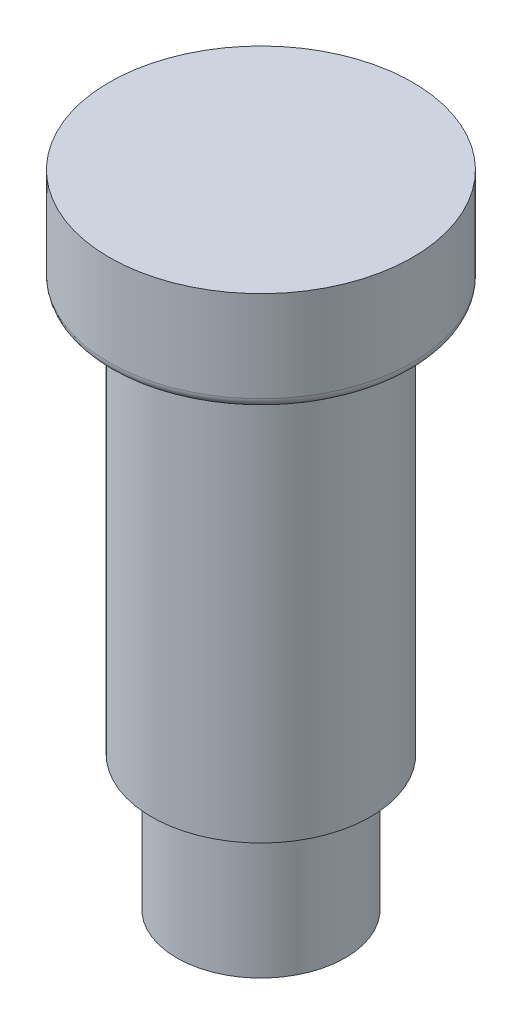
ISO-10303-21;
HEADER;
FILE_DESCRIPTION(('STEP AP214'),'2;1');
FILE_NAME('part.step','',(''),(''),'','','');
FILE_SCHEMA(('AUTOMOTIVE_DESIGN { 1 0 10303 214 1 1 1 1 }'));
ENDSEC;
DATA;
#1=APPLICATION_CONTEXT('core data for automotive mechanical design processes');
#2=APPLICATION_PROTOCOL_DEFINITION('international standard','automotive_design',2000,#1);
#3=PRODUCT_CONTEXT('',#1,'mechanical');
#4=PRODUCT('Part','Part','',(#3));
#5=PRODUCT_RELATED_PRODUCT_CATEGORY('part','',(#4));
#6=PRODUCT_DEFINITION_FORMATION('','',#4);
#7=PRODUCT_DEFINITION_CONTEXT('part definition',#1,'design');
#8=PRODUCT_DEFINITION('design','',#6,#7);
#9=PRODUCT_DEFINITION_SHAPE('','',#8);
#10=(LENGTH_UNIT() NAMED_UNIT(*) SI_UNIT(.MILLI.,.METRE.));
#11=(NAMED_UNIT(*) PLANE_ANGLE_UNIT() SI_UNIT($,.RADIAN.));
#12=(NAMED_UNIT(*) SI_UNIT($,.STERADIAN.) SOLID_ANGLE_UNIT());
#13=UNCERTAINTY_MEASURE_WITH_UNIT(LENGTH_MEASURE(1.E-05),#10,'distance_accuracy_value','');
#14=(GEOMETRIC_REPRESENTATION_CONTEXT(3) GLOBAL_UNCERTAINTY_ASSIGNED_CONTEXT((#13)) GLOBAL_UNIT_ASSIGNED_CONTEXT((#10,
#11,#12)) REPRESENTATION_CONTEXT('',''));
#15=CARTESIAN_POINT('',(0.,0.,0.));
#16=DIRECTION('',(0.,0.,1.));
#17=DIRECTION('',(1.,0.,0.));
#18=AXIS2_PLACEMENT_3D('',#15,#16,#17);
#19=CARTESIAN_POINT('',(0.,3.,0.));
#20=DIRECTION('',(0.,-1.,0.));
#21=DIRECTION('',(0.,0.,-1.));
#22=AXIS2_PLACEMENT_3D('',#19,#20,#21);
#23=CYLINDRICAL_SURFACE('',#22,4.5);
#24=CARTESIAN_POINT('',(0.,0.3,0.));
#25=DIRECTION('',(0.,1.,0.));
#26=DIRECTION('',(0.,0.,1.));
#27=AXIS2_PLACEMENT_3D('',#24,#25,#26);
#28=CIRCLE('',#27,4.5);
#29=CARTESIAN_POINT('',(0.,0.3,4.5));
#30=VERTEX_POINT('',#29);
#31=EDGE_CURVE('E41',#30,#30,#28,.T.);
#32=ORIENTED_EDGE('',*,*,#31,.T.);
#33=EDGE_LOOP('',(#32));
#34=FACE_BOUND('',#33,.T.);
#35=CARTESIAN_POINT('',(0.,3.,0.));
#36=DIRECTION('',(0.,1.,0.));
#37=DIRECTION('',(0.,0.,1.));
#38=AXIS2_PLACEMENT_3D('',#35,#36,#37);
#39=CIRCLE('',#38,4.5);
#40=CARTESIAN_POINT('',(0.,3.,4.5));
#41=VERTEX_POINT('',#40);
#42=EDGE_CURVE('E52',#41,#41,#39,.T.);
#43=ORIENTED_EDGE('',*,*,#42,.F.);
#44=EDGE_LOOP('',(#43));
#45=FACE_BOUND('',#44,.T.);
#46=ADVANCED_FACE('F34',(#34,#45),#23,.T.);
#47=CARTESIAN_POINT('',(0.,3.,0.));
#48=DIRECTION('',(0.,1.,0.));
#49=DIRECTION('',(0.,0.,1.));
#50=AXIS2_PLACEMENT_3D('',#47,#48,#49);
#51=PLANE('',#50);
#52=ORIENTED_EDGE('',*,*,#42,.T.);
#53=EDGE_LOOP('',(#52));
#54=FACE_BOUND('',#53,.T.);
#55=ADVANCED_FACE('F86',(#54),#51,.T.);
#56=CARTESIAN_POINT('',(0.,0.,0.));
#57=DIRECTION('',(0.,1.,0.));
#58=DIRECTION('',(0.,0.,1.));
#59=AXIS2_PLACEMENT_3D('',#56,#57,#58);
#60=PLANE('',#59);
#61=CARTESIAN_POINT('',(0.,0.,0.));
#62=DIRECTION('',(0.,1.,0.));
#63=DIRECTION('',(0.,0.,1.));
#64=AXIS2_PLACEMENT_3D('',#61,#62,#63);
#65=CIRCLE('',#64,4.2);
#66=CARTESIAN_POINT('',(0.,0.,4.2));
#67=VERTEX_POINT('',#66);
#68=EDGE_CURVE('E10',#67,#67,#65,.F.);
#69=ORIENTED_EDGE('',*,*,#68,.T.);
#70=EDGE_LOOP('',(#69));
#71=FACE_BOUND('',#70,.T.);
#72=CARTESIAN_POINT('',(0.,0.,0.));
#73=DIRECTION('',(0.,-1.,0.));
#74=DIRECTION('',(0.,0.,-1.));
#75=AXIS2_PLACEMENT_3D('',#72,#73,#74);
#76=CIRCLE('',#75,3.25);
#77=CARTESIAN_POINT('',(0.,0.,-3.25));
#78=VERTEX_POINT('',#77);
#79=EDGE_CURVE('E49',#78,#78,#76,.T.);
#80=ORIENTED_EDGE('',*,*,#79,.F.);
#81=EDGE_LOOP('',(#80));
#82=FACE_BOUND('',#81,.T.);
#83=ADVANCED_FACE('F81',(#71,#82),#60,.F.);
#84=CARTESIAN_POINT('',(0.,-12.,0.));
#85=DIRECTION('',(0.,1.,0.));
#86=DIRECTION('',(0.,0.,1.));
#87=AXIS2_PLACEMENT_3D('',#84,#85,#86);
#88=CYLINDRICAL_SURFACE('',#87,3.25);
#89=CARTESIAN_POINT('',(0.,-12.,0.));
#90=DIRECTION('',(0.,-1.,0.));
#91=DIRECTION('',(0.,0.,-1.));
#92=AXIS2_PLACEMENT_3D('',#89,#90,#91);
#93=CIRCLE('',#92,3.25);
#94=CARTESIAN_POINT('',(0.,-12.,-3.25));
#95=VERTEX_POINT('',#94);
#96=EDGE_CURVE('E55',#95,#95,#93,.T.);
#97=ORIENTED_EDGE('',*,*,#96,.F.);
#98=EDGE_LOOP('',(#97));
#99=FACE_BOUND('',#98,.T.);
#100=ORIENTED_EDGE('',*,*,#79,.T.);
#101=EDGE_LOOP('',(#100));
#102=FACE_BOUND('',#101,.T.);
#103=ADVANCED_FACE('F75',(#99,#102),#88,.T.);
#104=CARTESIAN_POINT('',(0.,-12.,0.));
#105=DIRECTION('',(0.,-1.,0.));
#106=DIRECTION('',(0.,0.,-1.));
#107=AXIS2_PLACEMENT_3D('',#104,#105,#106);
#108=PLANE('',#107);
#109=CARTESIAN_POINT('',(0.,-12.,0.));
#110=DIRECTION('',(0.,-1.,0.));
#111=DIRECTION('',(0.,0.,-1.));
#112=AXIS2_PLACEMENT_3D('',#109,#110,#111);
#113=CIRCLE('',#112,2.5);
#114=CARTESIAN_POINT('',(0.,-12.,-2.5));
#115=VERTEX_POINT('',#114);
#116=EDGE_CURVE('E45',#115,#115,#113,.T.);
#117=ORIENTED_EDGE('',*,*,#116,.F.);
#118=EDGE_LOOP('',(#117));
#119=FACE_BOUND('',#118,.T.);
#120=ORIENTED_EDGE('',*,*,#96,.T.);
#121=EDGE_LOOP('',(#120));
#122=FACE_BOUND('',#121,.T.);
#123=ADVANCED_FACE('F69',(#119,#122),#108,.T.);
#124=CARTESIAN_POINT('',(0.,-16.,0.));
#125=DIRECTION('',(0.,1.,0.));
#126=DIRECTION('',(0.,0.,1.));
#127=AXIS2_PLACEMENT_3D('',#124,#125,#126);
#128=CYLINDRICAL_SURFACE('',#127,2.5);
#129=CARTESIAN_POINT('',(0.,-16.,0.));
#130=DIRECTION('',(0.,-1.,0.));
#131=DIRECTION('',(0.,0.,-1.));
#132=AXIS2_PLACEMENT_3D('',#129,#130,#131);
#133=CIRCLE('',#132,2.5);
#134=CARTESIAN_POINT('',(0.,-16.,-2.5));
#135=VERTEX_POINT('',#134);
#136=EDGE_CURVE('E59',#135,#135,#133,.T.);
#137=ORIENTED_EDGE('',*,*,#136,.F.);
#138=EDGE_LOOP('',(#137));
#139=FACE_BOUND('',#138,.T.);
#140=ORIENTED_EDGE('',*,*,#116,.T.);
#141=EDGE_LOOP('',(#140));
#142=FACE_BOUND('',#141,.T.);
#143=ADVANCED_FACE('F66',(#139,#142),#128,.T.);
#144=CARTESIAN_POINT('',(0.,-16.,0.));
#145=DIRECTION('',(0.,-1.,0.));
#146=DIRECTION('',(0.,0.,-1.));
#147=AXIS2_PLACEMENT_3D('',#144,#145,#146);
#148=PLANE('',#147);
#149=ORIENTED_EDGE('',*,*,#136,.T.);
#150=EDGE_LOOP('',(#149));
#151=FACE_BOUND('',#150,.T.);
#152=ADVANCED_FACE('F64',(#151),#148,.T.);
#153=CARTESIAN_POINT('',(0.,0.3,0.));
#154=DIRECTION('',(0.,1.,0.));
#155=DIRECTION('',(0.,0.,1.));
#156=AXIS2_PLACEMENT_3D('',#153,#154,#155);
#157=TOROIDAL_SURFACE('',#156,4.2,0.3);
#158=ORIENTED_EDGE('',*,*,#68,.F.);
#159=EDGE_LOOP('',(#158));
#160=FACE_BOUND('',#159,.T.);
#161=ORIENTED_EDGE('',*,*,#31,.F.);
#162=EDGE_LOOP('',(#161));
#163=FACE_BOUND('',#162,.T.);
#164=ADVANCED_FACE('F36',(#160,#163),#157,.T.);
#165=CLOSED_SHELL('',(#46,#55,#83,#103,#123,#143,#152,#164));
#166=MANIFOLD_SOLID_BREP('B2',#165);
#167=ADVANCED_BREP_SHAPE_REPRESENTATION('',(#18,#166),#14);
#168=SHAPE_DEFINITION_REPRESENTATION(#9,#167);
ENDSEC;
END-ISO-10303-21;
